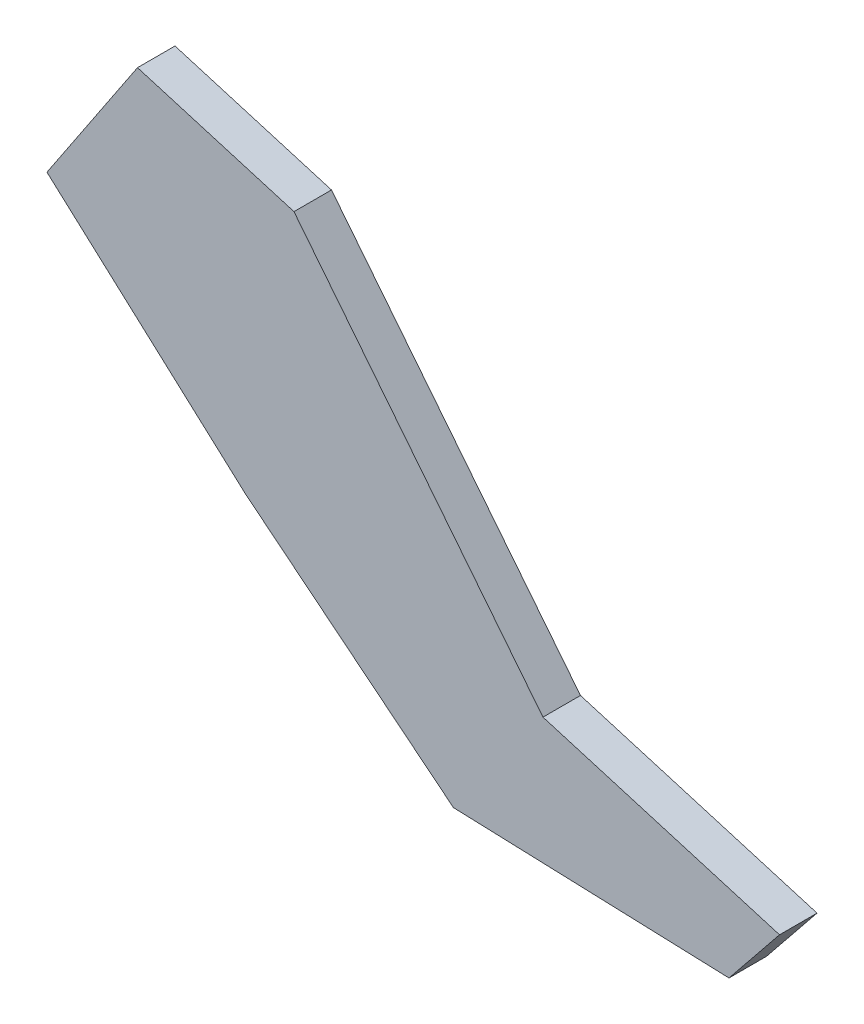
ISO-10303-21;
HEADER;
FILE_DESCRIPTION(('STEP AP214'),'2;1');
FILE_NAME('part.step','',(''),(''),'','','');
FILE_SCHEMA(('AUTOMOTIVE_DESIGN { 1 0 10303 214 1 1 1 1 }'));
ENDSEC;
DATA;
#1=APPLICATION_CONTEXT('core data for automotive mechanical design processes');
#2=APPLICATION_PROTOCOL_DEFINITION('international standard','automotive_design',2000,#1);
#3=PRODUCT_CONTEXT('',#1,'mechanical');
#4=PRODUCT('Part','Part','',(#3));
#5=PRODUCT_RELATED_PRODUCT_CATEGORY('part','',(#4));
#6=PRODUCT_DEFINITION_FORMATION('','',#4);
#7=PRODUCT_DEFINITION_CONTEXT('part definition',#1,'design');
#8=PRODUCT_DEFINITION('design','',#6,#7);
#9=PRODUCT_DEFINITION_SHAPE('','',#8);
#10=(LENGTH_UNIT() NAMED_UNIT(*) SI_UNIT(.MILLI.,.METRE.));
#11=(NAMED_UNIT(*) PLANE_ANGLE_UNIT() SI_UNIT($,.RADIAN.));
#12=(NAMED_UNIT(*) SI_UNIT($,.STERADIAN.) SOLID_ANGLE_UNIT());
#13=UNCERTAINTY_MEASURE_WITH_UNIT(LENGTH_MEASURE(1.E-05),#10,'distance_accuracy_value','');
#14=(GEOMETRIC_REPRESENTATION_CONTEXT(3) GLOBAL_UNCERTAINTY_ASSIGNED_CONTEXT((#13)) GLOBAL_UNIT_ASSIGNED_CONTEXT((#10,
#11,#12)) REPRESENTATION_CONTEXT('',''));
#15=CARTESIAN_POINT('',(0.,0.,0.));
#16=DIRECTION('',(0.,0.,1.));
#17=DIRECTION('',(1.,0.,0.));
#18=AXIS2_PLACEMENT_3D('',#15,#16,#17);
#19=CARTESIAN_POINT('',(732.835479136248,222.864021495225,-3.175));
#20=DIRECTION('',(-0.284447007171831,-0.958691764912471,0.));
#21=DIRECTION('',(0.958691764912471,-0.284447007171831,0.));
#22=AXIS2_PLACEMENT_3D('',#19,#20,#21);
#23=PLANE('',#22);
#24=DIRECTION('',(0.,0.,1.));
#25=VECTOR('',#24,1.);
#26=CARTESIAN_POINT('',(732.835479136248,222.864021495225,-3.175));
#27=LINE('',#26,#25);
#28=CARTESIAN_POINT('',(732.835479136248,222.864021495225,-3.175));
#29=VERTEX_POINT('',#28);
#30=CARTESIAN_POINT('',(732.835479136248,222.864021495225,3.175));
#31=VERTEX_POINT('',#30);
#32=EDGE_CURVE('E115',#29,#31,#27,.T.);
#33=ORIENTED_EDGE('',*,*,#32,.T.);
#34=DIRECTION('',(0.958691764912471,-0.284447007171831,0.));
#35=VECTOR('',#34,1.);
#36=CARTESIAN_POINT('',(732.835479136248,222.864021495225,3.175));
#37=LINE('',#36,#35);
#38=CARTESIAN_POINT('',(759.323844018918,215.004836310257,3.175));
#39=VERTEX_POINT('',#38);
#40=EDGE_CURVE('E109',#31,#39,#37,.T.);
#41=ORIENTED_EDGE('',*,*,#40,.T.);
#42=DIRECTION('',(0.,0.,1.));
#43=VECTOR('',#42,1.);
#44=CARTESIAN_POINT('',(759.323844018918,215.004836310257,-3.175));
#45=LINE('',#44,#43);
#46=CARTESIAN_POINT('',(759.323844018918,215.004836310257,-3.175));
#47=VERTEX_POINT('',#46);
#48=EDGE_CURVE('E11',#47,#39,#45,.T.);
#49=ORIENTED_EDGE('',*,*,#48,.F.);
#50=DIRECTION('',(0.958691764912471,-0.284447007171831,0.));
#51=VECTOR('',#50,1.);
#52=CARTESIAN_POINT('',(732.835479136248,222.864021495225,-3.175));
#53=LINE('',#52,#51);
#54=EDGE_CURVE('E133',#29,#47,#53,.T.);
#55=ORIENTED_EDGE('',*,*,#54,.F.);
#56=EDGE_LOOP('',(#33,#41,#49,#55));
#57=FACE_BOUND('',#56,.T.);
#58=ADVANCED_FACE('F33',(#57),#23,.F.);
#59=CARTESIAN_POINT('',(759.323844018918,215.004836310257,-3.175));
#60=DIRECTION('',(-0.782910555050748,-0.622134280352827,0.));
#61=DIRECTION('',(0.622134280352827,-0.782910555050748,0.));
#62=AXIS2_PLACEMENT_3D('',#59,#60,#61);
#63=PLANE('',#62);
#64=ORIENTED_EDGE('',*,*,#48,.T.);
#65=DIRECTION('',(0.622134280352827,-0.782910555050748,0.));
#66=VECTOR('',#65,1.);
#67=CARTESIAN_POINT('',(759.323844018918,215.004836310257,3.175));
#68=LINE('',#67,#66);
#69=CARTESIAN_POINT('',(801.469756390047,161.967283663442,3.175));
#70=VERTEX_POINT('',#69);
#71=EDGE_CURVE('E99',#39,#70,#68,.T.);
#72=ORIENTED_EDGE('',*,*,#71,.T.);
#73=DIRECTION('',(0.,0.,1.));
#74=VECTOR('',#73,1.);
#75=CARTESIAN_POINT('',(801.469756390047,161.967283663442,-3.175));
#76=LINE('',#75,#74);
#77=CARTESIAN_POINT('',(801.469756390047,161.967283663442,-3.175));
#78=VERTEX_POINT('',#77);
#79=EDGE_CURVE('E40',#78,#70,#76,.T.);
#80=ORIENTED_EDGE('',*,*,#79,.F.);
#81=DIRECTION('',(0.622134280352827,-0.782910555050748,0.));
#82=VECTOR('',#81,1.);
#83=CARTESIAN_POINT('',(759.323844018918,215.004836310257,-3.175));
#84=LINE('',#83,#82);
#85=EDGE_CURVE('E100',#47,#78,#84,.T.);
#86=ORIENTED_EDGE('',*,*,#85,.F.);
#87=EDGE_LOOP('',(#64,#72,#80,#86));
#88=FACE_BOUND('',#87,.T.);
#89=ADVANCED_FACE('F97',(#88),#63,.F.);
#90=CARTESIAN_POINT('',(801.469756390047,161.967283663442,-3.175));
#91=DIRECTION('',(-0.284447007171831,-0.958691764912471,0.));
#92=DIRECTION('',(0.958691764912471,-0.284447007171831,0.));
#93=AXIS2_PLACEMENT_3D('',#90,#91,#92);
#94=PLANE('',#93);
#95=ORIENTED_EDGE('',*,*,#79,.T.);
#96=DIRECTION('',(0.958691764912471,-0.284447007171831,0.));
#97=VECTOR('',#96,1.);
#98=CARTESIAN_POINT('',(801.469756390047,161.967283663442,3.175));
#99=LINE('',#98,#97);
#100=CARTESIAN_POINT('',(841.516125480316,150.085393933363,3.175));
#101=VERTEX_POINT('',#100);
#102=EDGE_CURVE('E113',#70,#101,#99,.T.);
#103=ORIENTED_EDGE('',*,*,#102,.T.);
#104=DIRECTION('',(0.,0.,1.));
#105=VECTOR('',#104,1.);
#106=CARTESIAN_POINT('',(841.516125480316,150.085393933363,-3.175));
#107=LINE('',#106,#105);
#108=CARTESIAN_POINT('',(841.516125480316,150.085393933363,-3.175));
#109=VERTEX_POINT('',#108);
#110=EDGE_CURVE('E155',#109,#101,#107,.T.);
#111=ORIENTED_EDGE('',*,*,#110,.F.);
#112=DIRECTION('',(0.958691764912471,-0.284447007171831,0.));
#113=VECTOR('',#112,1.);
#114=CARTESIAN_POINT('',(801.469756390047,161.967283663442,-3.175));
#115=LINE('',#114,#113);
#116=EDGE_CURVE('E136',#78,#109,#115,.T.);
#117=ORIENTED_EDGE('',*,*,#116,.F.);
#118=EDGE_LOOP('',(#95,#103,#111,#117));
#119=FACE_BOUND('',#118,.T.);
#120=ADVANCED_FACE('F158',(#119),#94,.F.);
#121=CARTESIAN_POINT('',(841.516125480316,150.085393933363,-3.175));
#122=DIRECTION('',(-0.778503105670912,0.6276407527087,0.));
#123=DIRECTION('',(-0.627640752708701,-0.778503105670913,0.));
#124=AXIS2_PLACEMENT_3D('',#121,#122,#123);
#125=PLANE('',#124);
#126=ORIENTED_EDGE('',*,*,#110,.T.);
#127=DIRECTION('',(-0.6276407527087,-0.778503105670912,0.));
#128=VECTOR('',#127,1.);
#129=CARTESIAN_POINT('',(841.516125480316,150.085393933363,3.175));
#130=LINE('',#129,#128);
#131=CARTESIAN_POINT('',(832.960803274094,139.473678746267,3.175));
#132=VERTEX_POINT('',#131);
#133=EDGE_CURVE('E119',#101,#132,#130,.T.);
#134=ORIENTED_EDGE('',*,*,#133,.T.);
#135=DIRECTION('',(0.,0.,1.));
#136=VECTOR('',#135,1.);
#137=CARTESIAN_POINT('',(832.960803274094,139.473678746267,-3.175));
#138=LINE('',#137,#136);
#139=CARTESIAN_POINT('',(832.960803274094,139.473678746267,-3.175));
#140=VERTEX_POINT('',#139);
#141=EDGE_CURVE('E153',#140,#132,#138,.T.);
#142=ORIENTED_EDGE('',*,*,#141,.F.);
#143=DIRECTION('',(-0.6276407527087,-0.778503105670912,0.));
#144=VECTOR('',#143,1.);
#145=CARTESIAN_POINT('',(841.516125480316,150.085393933363,-3.175));
#146=LINE('',#145,#144);
#147=EDGE_CURVE('E138',#109,#140,#146,.T.);
#148=ORIENTED_EDGE('',*,*,#147,.F.);
#149=EDGE_LOOP('',(#126,#134,#142,#148));
#150=FACE_BOUND('',#149,.T.);
#151=ADVANCED_FACE('F166',(#150),#125,.F.);
#152=CARTESIAN_POINT('',(832.960803274094,139.473678746267,-3.175));
#153=DIRECTION('',(0.0355105842750154,0.999369300311175,0.));
#154=DIRECTION('',(-0.999369300311175,0.0355105842750154,0.));
#155=AXIS2_PLACEMENT_3D('',#152,#153,#154);
#156=PLANE('',#155);
#157=ORIENTED_EDGE('',*,*,#141,.T.);
#158=DIRECTION('',(-0.999369300311175,0.0355105842750154,0.));
#159=VECTOR('',#158,1.);
#160=CARTESIAN_POINT('',(832.960803274094,139.473678746267,3.175));
#161=LINE('',#160,#159);
#162=CARTESIAN_POINT('',(786.316169919529,141.131102266479,3.175));
#163=VERTEX_POINT('',#162);
#164=EDGE_CURVE('E122',#132,#163,#161,.T.);
#165=ORIENTED_EDGE('',*,*,#164,.T.);
#166=DIRECTION('',(0.,0.,1.));
#167=VECTOR('',#166,1.);
#168=CARTESIAN_POINT('',(786.316169919529,141.131102266479,-3.175));
#169=LINE('',#168,#167);
#170=CARTESIAN_POINT('',(786.316169919529,141.131102266479,-3.175));
#171=VERTEX_POINT('',#170);
#172=EDGE_CURVE('E151',#171,#163,#169,.T.);
#173=ORIENTED_EDGE('',*,*,#172,.F.);
#174=DIRECTION('',(-0.999369300311175,0.0355105842750154,0.));
#175=VECTOR('',#174,1.);
#176=CARTESIAN_POINT('',(832.960803274094,139.473678746267,-3.175));
#177=LINE('',#176,#175);
#178=EDGE_CURVE('E140',#140,#171,#177,.T.);
#179=ORIENTED_EDGE('',*,*,#178,.F.);
#180=EDGE_LOOP('',(#157,#165,#173,#179));
#181=FACE_BOUND('',#180,.T.);
#182=ADVANCED_FACE('F169',(#181),#156,.F.);
#183=CARTESIAN_POINT('',(786.316169919529,141.131102266479,-3.175));
#184=DIRECTION('',(0.627640752708701,0.778503105670912,0.));
#185=DIRECTION('',(-0.778503105670912,0.627640752708701,0.));
#186=AXIS2_PLACEMENT_3D('',#183,#184,#185);
#187=PLANE('',#186);
#188=ORIENTED_EDGE('',*,*,#172,.T.);
#189=DIRECTION('',(-0.778503105670912,0.627640752708701,0.));
#190=VECTOR('',#189,1.);
#191=CARTESIAN_POINT('',(786.316169919529,141.131102266479,3.175));
#192=LINE('',#191,#190);
#193=CARTESIAN_POINT('',(751.111381007148,169.513725342691,3.175));
#194=VERTEX_POINT('',#193);
#195=EDGE_CURVE('E125',#163,#194,#192,.T.);
#196=ORIENTED_EDGE('',*,*,#195,.T.);
#197=DIRECTION('',(0.,0.,1.));
#198=VECTOR('',#197,1.);
#199=CARTESIAN_POINT('',(751.111381007148,169.513725342691,-3.175));
#200=LINE('',#199,#198);
#201=CARTESIAN_POINT('',(751.111381007148,169.513725342691,-3.175));
#202=VERTEX_POINT('',#201);
#203=EDGE_CURVE('E149',#202,#194,#200,.T.);
#204=ORIENTED_EDGE('',*,*,#203,.F.);
#205=DIRECTION('',(-0.778503105670912,0.627640752708701,0.));
#206=VECTOR('',#205,1.);
#207=CARTESIAN_POINT('',(786.316169919529,141.131102266479,-3.175));
#208=LINE('',#207,#206);
#209=EDGE_CURVE('E142',#171,#202,#208,.T.);
#210=ORIENTED_EDGE('',*,*,#209,.F.);
#211=EDGE_LOOP('',(#188,#196,#204,#210));
#212=FACE_BOUND('',#211,.T.);
#213=ADVANCED_FACE('F174',(#212),#187,.F.);
#214=CARTESIAN_POINT('',(751.111381007148,169.513725342691,-3.175));
#215=DIRECTION('',(0.670405784220974,0.741994666074535,0.));
#216=DIRECTION('',(-0.741994666074535,0.670405784220974,0.));
#217=AXIS2_PLACEMENT_3D('',#214,#215,#216);
#218=PLANE('',#217);
#219=ORIENTED_EDGE('',*,*,#203,.T.);
#220=DIRECTION('',(-0.741994666074535,0.670405784220974,0.));
#221=VECTOR('',#220,1.);
#222=CARTESIAN_POINT('',(751.111381007148,169.513725342691,3.175));
#223=LINE('',#222,#221);
#224=CARTESIAN_POINT('',(717.508912563147,199.874171635573,3.175));
#225=VERTEX_POINT('',#224);
#226=EDGE_CURVE('E128',#194,#225,#223,.T.);
#227=ORIENTED_EDGE('',*,*,#226,.T.);
#228=DIRECTION('',(0.,0.,1.));
#229=VECTOR('',#228,1.);
#230=CARTESIAN_POINT('',(717.508912563147,199.874171635573,-3.175));
#231=LINE('',#230,#229);
#232=CARTESIAN_POINT('',(717.508912563147,199.874171635573,-3.175));
#233=VERTEX_POINT('',#232);
#234=EDGE_CURVE('E147',#233,#225,#231,.T.);
#235=ORIENTED_EDGE('',*,*,#234,.F.);
#236=DIRECTION('',(-0.741994666074535,0.670405784220974,0.));
#237=VECTOR('',#236,1.);
#238=CARTESIAN_POINT('',(751.111381007148,169.513725342691,-3.175));
#239=LINE('',#238,#237);
#240=EDGE_CURVE('E52',#202,#233,#239,.T.);
#241=ORIENTED_EDGE('',*,*,#240,.F.);
#242=EDGE_LOOP('',(#219,#227,#235,#241));
#243=FACE_BOUND('',#242,.T.);
#244=ADVANCED_FACE('F177',(#243),#218,.F.);
#245=CARTESIAN_POINT('',(717.508912563147,199.874171635573,-3.175));
#246=DIRECTION('',(0.832050294337843,-0.55470019622523,0.));
#247=DIRECTION('',(0.55470019622523,0.832050294337843,0.));
#248=AXIS2_PLACEMENT_3D('',#245,#246,#247);
#249=PLANE('',#248);
#250=ORIENTED_EDGE('',*,*,#234,.T.);
#251=DIRECTION('',(0.55470019622523,0.832050294337843,0.));
#252=VECTOR('',#251,1.);
#253=CARTESIAN_POINT('',(717.508912563147,199.874171635573,3.175));
#254=LINE('',#253,#252);
#255=EDGE_CURVE('E131',#225,#31,#254,.T.);
#256=ORIENTED_EDGE('',*,*,#255,.T.);
#257=ORIENTED_EDGE('',*,*,#32,.F.);
#258=DIRECTION('',(0.55470019622523,0.832050294337843,0.));
#259=VECTOR('',#258,1.);
#260=CARTESIAN_POINT('',(717.508912563147,199.874171635573,-3.175));
#261=LINE('',#260,#259);
#262=EDGE_CURVE('E47',#233,#29,#261,.T.);
#263=ORIENTED_EDGE('',*,*,#262,.F.);
#264=EDGE_LOOP('',(#250,#256,#257,#263));
#265=FACE_BOUND('',#264,.T.);
#266=ADVANCED_FACE('F179',(#265),#249,.F.);
#267=CARTESIAN_POINT('',(0.,0.,-3.175));
#268=DIRECTION('',(0.,0.,1.));
#269=DIRECTION('',(1.,0.,0.));
#270=AXIS2_PLACEMENT_3D('',#267,#268,#269);
#271=PLANE('',#270);
#272=ORIENTED_EDGE('',*,*,#54,.T.);
#273=ORIENTED_EDGE('',*,*,#85,.T.);
#274=ORIENTED_EDGE('',*,*,#116,.T.);
#275=ORIENTED_EDGE('',*,*,#147,.T.);
#276=ORIENTED_EDGE('',*,*,#178,.T.);
#277=ORIENTED_EDGE('',*,*,#209,.T.);
#278=ORIENTED_EDGE('',*,*,#240,.T.);
#279=ORIENTED_EDGE('',*,*,#262,.T.);
#280=EDGE_LOOP('',(#272,#273,#274,#275,#276,#277,#278,#279));
#281=FACE_BOUND('',#280,.T.);
#282=ADVANCED_FACE('F161',(#281),#271,.F.);
#283=CARTESIAN_POINT('',(0.,0.,3.175));
#284=DIRECTION('',(0.,0.,1.));
#285=DIRECTION('',(1.,0.,0.));
#286=AXIS2_PLACEMENT_3D('',#283,#284,#285);
#287=PLANE('',#286);
#288=ORIENTED_EDGE('',*,*,#40,.F.);
#289=ORIENTED_EDGE('',*,*,#255,.F.);
#290=ORIENTED_EDGE('',*,*,#226,.F.);
#291=ORIENTED_EDGE('',*,*,#195,.F.);
#292=ORIENTED_EDGE('',*,*,#164,.F.);
#293=ORIENTED_EDGE('',*,*,#133,.F.);
#294=ORIENTED_EDGE('',*,*,#102,.F.);
#295=ORIENTED_EDGE('',*,*,#71,.F.);
#296=EDGE_LOOP('',(#288,#289,#290,#291,#292,#293,#294,#295));
#297=FACE_BOUND('',#296,.T.);
#298=ADVANCED_FACE('F107',(#297),#287,.T.);
#299=CLOSED_SHELL('',(#58,#89,#120,#151,#182,#213,#244,#266,#282,#298));
#300=MANIFOLD_SOLID_BREP('B2',#299);
#301=ADVANCED_BREP_SHAPE_REPRESENTATION('',(#18,#300),#14);
#302=SHAPE_DEFINITION_REPRESENTATION(#9,#301);
ENDSEC;
END-ISO-10303-21;
